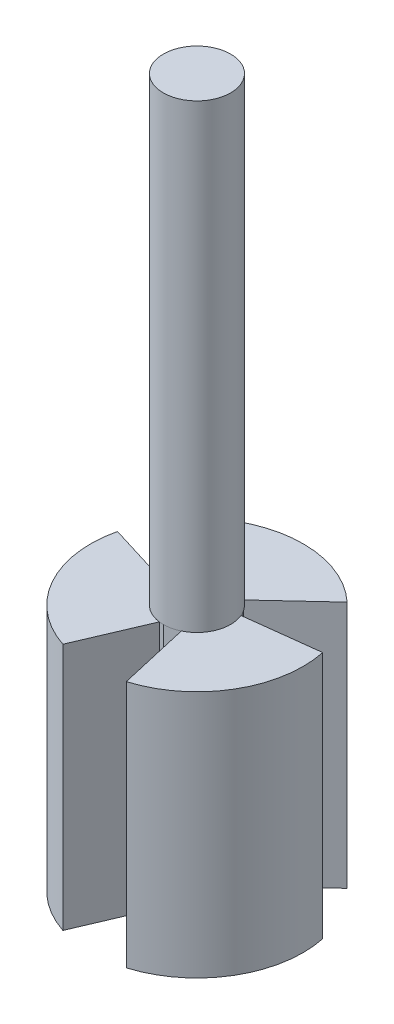
ISO-10303-21;
HEADER;
FILE_DESCRIPTION(('STEP AP214'),'2;1');
FILE_NAME('part.step','',(''),(''),'','','');
FILE_SCHEMA(('AUTOMOTIVE_DESIGN { 1 0 10303 214 1 1 1 1 }'));
ENDSEC;
DATA;
#1=APPLICATION_CONTEXT('core data for automotive mechanical design processes');
#2=APPLICATION_PROTOCOL_DEFINITION('international standard','automotive_design',2000,#1);
#3=PRODUCT_CONTEXT('',#1,'mechanical');
#4=PRODUCT('Part','Part','',(#3));
#5=PRODUCT_RELATED_PRODUCT_CATEGORY('part','',(#4));
#6=PRODUCT_DEFINITION_FORMATION('','',#4);
#7=PRODUCT_DEFINITION_CONTEXT('part definition',#1,'design');
#8=PRODUCT_DEFINITION('design','',#6,#7);
#9=PRODUCT_DEFINITION_SHAPE('','',#8);
#10=(LENGTH_UNIT() NAMED_UNIT(*) SI_UNIT(.MILLI.,.METRE.));
#11=(NAMED_UNIT(*) PLANE_ANGLE_UNIT() SI_UNIT($,.RADIAN.));
#12=(NAMED_UNIT(*) SI_UNIT($,.STERADIAN.) SOLID_ANGLE_UNIT());
#13=UNCERTAINTY_MEASURE_WITH_UNIT(LENGTH_MEASURE(1.E-05),#10,'distance_accuracy_value','');
#14=(GEOMETRIC_REPRESENTATION_CONTEXT(3) GLOBAL_UNCERTAINTY_ASSIGNED_CONTEXT((#13)) GLOBAL_UNIT_ASSIGNED_CONTEXT((#10,
#11,#12)) REPRESENTATION_CONTEXT('',''));
#15=CARTESIAN_POINT('',(0.,0.,0.));
#16=DIRECTION('',(0.,0.,1.));
#17=DIRECTION('',(1.,0.,0.));
#18=AXIS2_PLACEMENT_3D('',#15,#16,#17);
#19=CARTESIAN_POINT('',(0.,70.,0.));
#20=DIRECTION('',(0.,-1.,0.));
#21=DIRECTION('',(0.,0.,-1.));
#22=AXIS2_PLACEMENT_3D('',#19,#20,#21);
#23=CYLINDRICAL_SURFACE('',#22,30.);
#24=DIRECTION('',(0.,-1.,0.));
#25=VECTOR('',#24,1.);
#26=CARTESIAN_POINT('',(-29.225211014232,70.,-6.7739974294068));
#27=LINE('',#26,#25);
#28=CARTESIAN_POINT('',(-29.2252110142321,0.,-6.7739974294068));
#29=VERTEX_POINT('',#28);
#30=CARTESIAN_POINT('',(-29.2252110142321,70.,-6.7739974294068));
#31=VERTEX_POINT('',#30);
#32=EDGE_CURVE('E212',#29,#31,#27,.F.);
#33=ORIENTED_EDGE('',*,*,#32,.F.);
#34=CARTESIAN_POINT('',(0.,0.,0.));
#35=DIRECTION('',(0.,-1.,0.));
#36=DIRECTION('',(0.,0.,-1.));
#37=AXIS2_PLACEMENT_3D('',#34,#35,#36);
#38=CIRCLE('',#37,30.);
#39=CARTESIAN_POINT('',(-9.35973533694648,0.,28.5025499635088));
#40=VERTEX_POINT('',#39);
#41=EDGE_CURVE('E255',#40,#29,#38,.T.);
#42=ORIENTED_EDGE('',*,*,#41,.F.);
#43=DIRECTION('',(0.,-1.,0.));
#44=VECTOR('',#43,1.);
#45=CARTESIAN_POINT('',(-9.35973533694648,70.,28.5025499635088));
#46=LINE('',#45,#44);
#47=CARTESIAN_POINT('',(-9.35973533694648,70.,28.5025499635088));
#48=VERTEX_POINT('',#47);
#49=EDGE_CURVE('E238',#48,#40,#46,.T.);
#50=ORIENTED_EDGE('',*,*,#49,.F.);
#51=CARTESIAN_POINT('',(0.,70.,0.));
#52=DIRECTION('',(0.,-1.,0.));
#53=DIRECTION('',(0.,0.,-1.));
#54=AXIS2_PLACEMENT_3D('',#51,#52,#53);
#55=CIRCLE('',#54,30.);
#56=EDGE_CURVE('E249',#48,#31,#55,.T.);
#57=ORIENTED_EDGE('',*,*,#56,.T.);
#58=EDGE_LOOP('',(#33,#42,#50,#57));
#59=FACE_BOUND('',#58,.T.);
#60=ADVANCED_FACE('F37',(#59),#23,.T.);
#61=DIRECTION('',(0.,-1.,0.));
#62=VECTOR('',#61,1.);
#63=CARTESIAN_POINT('',(-20.0040646725605,70.,-22.357043556249));
#64=LINE('',#63,#62);
#65=CARTESIAN_POINT('',(-20.0040646725605,70.,-22.357043556249));
#66=VERTEX_POINT('',#65);
#67=CARTESIAN_POINT('',(-20.0040646725605,0.,-22.357043556249));
#68=VERTEX_POINT('',#67);
#69=EDGE_CURVE('E210',#66,#68,#64,.T.);
#70=ORIENTED_EDGE('',*,*,#69,.F.);
#71=CARTESIAN_POINT('',(20.4790593661529,70.,-21.9227764545822));
#72=VERTEX_POINT('',#71);
#73=EDGE_CURVE('E253',#66,#72,#55,.T.);
#74=ORIENTED_EDGE('',*,*,#73,.T.);
#75=DIRECTION('',(0.,-1.,0.));
#76=VECTOR('',#75,1.);
#77=CARTESIAN_POINT('',(20.4790593661529,70.,-21.9227764545822));
#78=LINE('',#77,#76);
#79=CARTESIAN_POINT('',(20.4790593661529,0.,-21.9227764545822));
#80=VERTEX_POINT('',#79);
#81=EDGE_CURVE('E208',#80,#72,#78,.F.);
#82=ORIENTED_EDGE('',*,*,#81,.F.);
#83=EDGE_CURVE('E257',#68,#80,#38,.T.);
#84=ORIENTED_EDGE('',*,*,#83,.F.);
#85=EDGE_LOOP('',(#70,#74,#82,#84));
#86=FACE_BOUND('',#85,.T.);
#87=ADVANCED_FACE('F277',(#86),#23,.T.);
#88=CARTESIAN_POINT('',(0.,70.,0.));
#89=DIRECTION('',(0.,-1.,0.));
#90=DIRECTION('',(0.,0.,-1.));
#91=AXIS2_PLACEMENT_3D('',#88,#89,#90);
#92=PLANE('',#91);
#93=CARTESIAN_POINT('',(0.,70.,0.));
#94=DIRECTION('',(0.,-1.,0.));
#95=DIRECTION('',(0.,0.,-1.));
#96=AXIS2_PLACEMENT_3D('',#93,#94,#95);
#97=CIRCLE('',#96,9.5);
#98=CARTESIAN_POINT('',(-1.21301734780421,70.,9.4222390605379));
#99=VERTEX_POINT('',#98);
#100=CARTESIAN_POINT('',(-9.47441557328108,70.,-0.696742093438399));
#101=VERTEX_POINT('',#100);
#102=EDGE_CURVE('E311',#99,#101,#97,.T.);
#103=ORIENTED_EDGE('',*,*,#102,.T.);
#104=DIRECTION('',(0.955777818427239,0.,0.294089717267484));
#105=VECTOR('',#104,1.);
#106=CARTESIAN_POINT('',(-9.47441557328108,70.,-0.696742093438399));
#107=LINE('',#106,#105);
#108=EDGE_CURVE('E168',#31,#101,#107,.T.);
#109=ORIENTED_EDGE('',*,*,#108,.F.);
#110=ORIENTED_EDGE('',*,*,#56,.F.);
#111=DIRECTION('',(-0.392674581394014,0.,0.919677483211933));
#112=VECTOR('',#111,1.);
#113=CARTESIAN_POINT('',(-10.9395756302939,70.,32.2026711674444));
#114=LINE('',#113,#112);
#115=EDGE_CURVE('E231',#99,#48,#114,.T.);
#116=ORIENTED_EDGE('',*,*,#115,.F.);
#117=EDGE_LOOP('',(#103,#109,#110,#116));
#118=FACE_BOUND('',#117,.T.);
#119=ADVANCED_FACE('F331',(#118),#92,.F.);
#120=ORIENTED_EDGE('',*,*,#73,.F.);
#121=DIRECTION('',(-0.60012677305306,0.,-0.799904904513606));
#122=VECTOR('',#121,1.);
#123=CARTESIAN_POINT('',(-22.4185434855765,70.,-25.575285986178));
#124=LINE('',#123,#122);
#125=CARTESIAN_POINT('',(-7.55338971305371,70.,-5.76162336869865));
#126=VERTEX_POINT('',#125);
#127=EDGE_CURVE('E170',#126,#66,#124,.T.);
#128=ORIENTED_EDGE('',*,*,#127,.F.);
#129=CARTESIAN_POINT('',(5.34060413944418,70.,-7.8567135257531));
#130=VERTEX_POINT('',#129);
#131=EDGE_CURVE('E302',#126,#130,#97,.T.);
#132=ORIENTED_EDGE('',*,*,#131,.T.);
#133=DIRECTION('',(-0.732578075359047,0.,0.680683012497914));
#134=VECTOR('',#133,1.);
#135=CARTESIAN_POINT('',(5.34060413944418,70.,-7.8567135257531));
#136=LINE('',#135,#134);
#137=EDGE_CURVE('E187',#72,#130,#136,.T.);
#138=ORIENTED_EDGE('',*,*,#137,.F.);
#139=EDGE_LOOP('',(#120,#128,#132,#138));
#140=FACE_BOUND('',#139,.T.);
#141=ADVANCED_FACE('F334',(#140),#92,.F.);
#142=CARTESIAN_POINT('',(0.,200.,0.));
#143=DIRECTION('',(0.,-1.,0.));
#144=DIRECTION('',(0.,0.,-1.));
#145=AXIS2_PLACEMENT_3D('',#142,#143,#144);
#146=CYLINDRICAL_SURFACE('',#145,9.5);
#147=CARTESIAN_POINT('',(0.,200.,0.));
#148=DIRECTION('',(0.,1.,0.));
#149=DIRECTION('',(0.,0.,1.));
#150=AXIS2_PLACEMENT_3D('',#147,#148,#149);
#151=CIRCLE('',#150,9.5);
#152=CARTESIAN_POINT('',(0.,200.,9.5));
#153=VERTEX_POINT('',#152);
#154=EDGE_CURVE('E252',#153,#153,#151,.T.);
#155=ORIENTED_EDGE('',*,*,#154,.F.);
#156=EDGE_LOOP('',(#155));
#157=FACE_BOUND('',#156,.T.);
#158=CARTESIAN_POINT('',(4.13381143383698,70.,8.5534556191915));
#159=VERTEX_POINT('',#158);
#160=CARTESIAN_POINT('',(0.,70.,9.5));
#161=VERTEX_POINT('',#160);
#162=EDGE_CURVE('E261',#159,#161,#97,.T.);
#163=ORIENTED_EDGE('',*,*,#162,.F.);
#164=CARTESIAN_POINT('',(8.76640706085798,70.,-3.6606156918392));
#165=VERTEX_POINT('',#164);
#166=EDGE_CURVE('E260',#165,#159,#97,.T.);
#167=ORIENTED_EDGE('',*,*,#166,.F.);
#168=CARTESIAN_POINT('',(8.22724133595221,70.,-4.74999999999992));
#169=VERTEX_POINT('',#168);
#170=EDGE_CURVE('E298',#169,#165,#97,.T.);
#171=ORIENTED_EDGE('',*,*,#170,.F.);
#172=EDGE_CURVE('E299',#130,#169,#97,.T.);
#173=ORIENTED_EDGE('',*,*,#172,.F.);
#174=ORIENTED_EDGE('',*,*,#131,.F.);
#175=CARTESIAN_POINT('',(-8.22724133595215,70.,-4.75000000000004));
#176=VERTEX_POINT('',#175);
#177=EDGE_CURVE('E307',#176,#126,#97,.T.);
#178=ORIENTED_EDGE('',*,*,#177,.F.);
#179=EDGE_CURVE('E309',#101,#176,#97,.T.);
#180=ORIENTED_EDGE('',*,*,#179,.F.);
#181=ORIENTED_EDGE('',*,*,#102,.F.);
#182=EDGE_CURVE('E264',#161,#99,#97,.T.);
#183=ORIENTED_EDGE('',*,*,#182,.F.);
#184=EDGE_LOOP('',(#163,#167,#171,#173,#174,#178,#180,#181,#183));
#185=FACE_BOUND('',#184,.T.);
#186=ADVANCED_FACE('F39',(#157,#185),#146,.T.);
#187=CARTESIAN_POINT('',(0.,200.,0.));
#188=DIRECTION('',(0.,1.,0.));
#189=DIRECTION('',(0.,0.,1.));
#190=AXIS2_PLACEMENT_3D('',#187,#188,#189);
#191=PLANE('',#190);
#192=ORIENTED_EDGE('',*,*,#154,.T.);
#193=EDGE_LOOP('',(#192));
#194=FACE_BOUND('',#193,.T.);
#195=ADVANCED_FACE('F333',(#194),#191,.T.);
#196=DIRECTION('',(0.,-1.,0.));
#197=VECTOR('',#196,1.);
#198=CARTESIAN_POINT('',(29.3638000095071,70.,-6.14550640725957));
#199=LINE('',#198,#197);
#200=CARTESIAN_POINT('',(29.3638000095071,70.,-6.14550640725957));
#201=VERTEX_POINT('',#200);
#202=CARTESIAN_POINT('',(29.3638000095071,0.,-6.14550640725957));
#203=VERTEX_POINT('',#202);
#204=EDGE_CURVE('E181',#201,#203,#199,.T.);
#205=ORIENTED_EDGE('',*,*,#204,.F.);
#206=CARTESIAN_POINT('',(8.74615164807938,70.,28.6967738839891));
#207=VERTEX_POINT('',#206);
#208=EDGE_CURVE('E254',#201,#207,#55,.T.);
#209=ORIENTED_EDGE('',*,*,#208,.T.);
#210=DIRECTION('',(0.,-1.,0.));
#211=VECTOR('',#210,1.);
#212=CARTESIAN_POINT('',(8.74615164807938,70.,28.6967738839891));
#213=LINE('',#212,#211);
#214=CARTESIAN_POINT('',(8.74615164807938,0.,28.6967738839891));
#215=VERTEX_POINT('',#214);
#216=EDGE_CURVE('E245',#215,#207,#213,.F.);
#217=ORIENTED_EDGE('',*,*,#216,.F.);
#218=EDGE_CURVE('E248',#203,#215,#38,.T.);
#219=ORIENTED_EDGE('',*,*,#218,.F.);
#220=EDGE_LOOP('',(#205,#209,#217,#219));
#221=FACE_BOUND('',#220,.T.);
#222=ADVANCED_FACE('F285',(#221),#23,.T.);
#223=ORIENTED_EDGE('',*,*,#208,.F.);
#224=DIRECTION('',(0.992801354447079,0.,-0.119772578698321));
#225=VECTOR('',#224,1.);
#226=CARTESIAN_POINT('',(33.3581191158705,70.,-6.62738518126624));
#227=LINE('',#226,#225);
#228=EDGE_CURVE('E198',#165,#201,#227,.T.);
#229=ORIENTED_EDGE('',*,*,#228,.F.);
#230=ORIENTED_EDGE('',*,*,#166,.T.);
#231=DIRECTION('',(-0.2231997430682,0.,-0.9747727297654));
#232=VECTOR('',#231,1.);
#233=CARTESIAN_POINT('',(4.13381143383698,70.,8.5534556191915));
#234=LINE('',#233,#232);
#235=EDGE_CURVE('E219',#207,#159,#234,.T.);
#236=ORIENTED_EDGE('',*,*,#235,.F.);
#237=EDGE_LOOP('',(#223,#229,#230,#236));
#238=FACE_BOUND('',#237,.T.);
#239=ADVANCED_FACE('F293',(#238),#92,.F.);
#240=CARTESIAN_POINT('',(0.,0.,0.));
#241=DIRECTION('',(0.,1.,0.));
#242=DIRECTION('',(0.,0.,1.));
#243=AXIS2_PLACEMENT_3D('',#240,#241,#242);
#244=PLANE('',#243);
#245=ORIENTED_EDGE('',*,*,#41,.T.);
#246=DIRECTION('',(0.955777818427239,0.,0.294089717267484));
#247=VECTOR('',#246,1.);
#248=CARTESIAN_POINT('',(-0.623587118664468,0.,2.02662895328082));
#249=LINE('',#248,#247);
#250=CARTESIAN_POINT('',(-9.47441557328108,0.,-0.696742093438399));
#251=VERTEX_POINT('',#250);
#252=EDGE_CURVE('E11',#29,#251,#249,.T.);
#253=ORIENTED_EDGE('',*,*,#252,.T.);
#254=DIRECTION('',(0.294089717267484,0.,-0.955777818427239));
#255=VECTOR('',#254,1.);
#256=CARTESIAN_POINT('',(-8.22724133595215,0.,-4.75000000000004));
#257=LINE('',#256,#255);
#258=CARTESIAN_POINT('',(-8.22724133595215,0.,-4.75000000000004));
#259=VERTEX_POINT('',#258);
#260=EDGE_CURVE('E152',#251,#259,#257,.T.);
#261=ORIENTED_EDGE('',*,*,#260,.T.);
#262=DIRECTION('',(0.554378946406689,0.,-0.832264371327411));
#263=VECTOR('',#262,1.);
#264=CARTESIAN_POINT('',(-7.55338971305371,0.,-5.76162336869865));
#265=LINE('',#264,#263);
#266=CARTESIAN_POINT('',(-7.55338971305371,0.,-5.76162336869865));
#267=VERTEX_POINT('',#266);
#268=EDGE_CURVE('E162',#259,#267,#265,.T.);
#269=ORIENTED_EDGE('',*,*,#268,.T.);
#270=DIRECTION('',(-0.60012677305306,0.,-0.799904904513606));
#271=VECTOR('',#270,1.);
#272=CARTESIAN_POINT('',(-22.4185434855765,0.,-25.575285986178));
#273=LINE('',#272,#271);
#274=EDGE_CURVE('E52',#267,#68,#273,.T.);
#275=ORIENTED_EDGE('',*,*,#274,.T.);
#276=ORIENTED_EDGE('',*,*,#83,.T.);
#277=DIRECTION('',(-0.732578075359047,0.,0.680683012497914));
#278=VECTOR('',#277,1.);
#279=CARTESIAN_POINT('',(-1.44331859825402,0.,-1.55335676287659));
#280=LINE('',#279,#278);
#281=CARTESIAN_POINT('',(5.34060413944418,0.,-7.8567135257531));
#282=VERTEX_POINT('',#281);
#283=EDGE_CURVE('E45',#80,#282,#280,.T.);
#284=ORIENTED_EDGE('',*,*,#283,.T.);
#285=DIRECTION('',(0.680683012497914,0.,0.732578075359046));
#286=VECTOR('',#285,1.);
#287=CARTESIAN_POINT('',(8.22724133595221,0.,-4.74999999999992));
#288=LINE('',#287,#286);
#289=CARTESIAN_POINT('',(8.22724133595221,0.,-4.74999999999992));
#290=VERTEX_POINT('',#289);
#291=EDGE_CURVE('E183',#282,#290,#288,.T.);
#292=ORIENTED_EDGE('',*,*,#291,.T.);
#293=DIRECTION('',(0.443572615030874,0.,0.896238436575151));
#294=VECTOR('',#293,1.);
#295=CARTESIAN_POINT('',(8.76640706085798,0.,-3.6606156918392));
#296=LINE('',#295,#294);
#297=CARTESIAN_POINT('',(8.76640706085798,0.,-3.6606156918392));
#298=VERTEX_POINT('',#297);
#299=EDGE_CURVE('E186',#290,#298,#296,.T.);
#300=ORIENTED_EDGE('',*,*,#299,.T.);
#301=DIRECTION('',(0.992801354447079,0.,-0.119772578698321));
#302=VECTOR('',#301,1.);
#303=CARTESIAN_POINT('',(33.3581191158705,0.,-6.62738518126624));
#304=LINE('',#303,#302);
#305=EDGE_CURVE('E60',#298,#203,#304,.T.);
#306=ORIENTED_EDGE('',*,*,#305,.T.);
#307=ORIENTED_EDGE('',*,*,#218,.T.);
#308=DIRECTION('',(-0.2231997430682,0.,-0.9747727297654));
#309=VECTOR('',#308,1.);
#310=CARTESIAN_POINT('',(2.06690571691849,0.,-0.473272190404249));
#311=LINE('',#310,#309);
#312=CARTESIAN_POINT('',(4.13381143383698,0.,8.5534556191915));
#313=VERTEX_POINT('',#312);
#314=EDGE_CURVE('E263',#215,#313,#311,.T.);
#315=ORIENTED_EDGE('',*,*,#314,.T.);
#316=DIRECTION('',(-0.9747727297654,0.,0.2231997430682));
#317=VECTOR('',#316,1.);
#318=CARTESIAN_POINT('',(0.,0.,9.5));
#319=LINE('',#318,#317);
#320=CARTESIAN_POINT('',(0.,0.,9.5));
#321=VERTEX_POINT('',#320);
#322=EDGE_CURVE('E215',#313,#321,#319,.T.);
#323=ORIENTED_EDGE('',*,*,#322,.T.);
#324=DIRECTION('',(-0.997951561437567,0.,-0.0639740652477342));
#325=VECTOR('',#324,1.);
#326=CARTESIAN_POINT('',(-1.21301734780421,0.,9.4222390605379));
#327=LINE('',#326,#325);
#328=CARTESIAN_POINT('',(-1.21301734780421,0.,9.4222390605379));
#329=VERTEX_POINT('',#328);
#330=EDGE_CURVE('E218',#321,#329,#327,.T.);
#331=ORIENTED_EDGE('',*,*,#330,.T.);
#332=DIRECTION('',(-0.392674581394014,0.,0.919677483211933));
#333=VECTOR('',#332,1.);
#334=CARTESIAN_POINT('',(-10.9395756302939,0.,32.2026711674444));
#335=LINE('',#334,#333);
#336=EDGE_CURVE('E222',#329,#40,#335,.T.);
#337=ORIENTED_EDGE('',*,*,#336,.T.);
#338=EDGE_LOOP('',(#245,#253,#261,#269,#275,#276,#284,#292,#300,#306,#307,#315,#323,#331,#337));
#339=FACE_BOUND('',#338,.T.);
#340=ADVANCED_FACE('F167',(#339),#244,.F.);
#341=CARTESIAN_POINT('',(0.,70.,0.));
#342=DIRECTION('',(0.,-1.,0.));
#343=DIRECTION('',(0.,0.,-1.));
#344=AXIS2_PLACEMENT_3D('',#341,#342,#343);
#345=PLANE('',#344);
#346=ORIENTED_EDGE('',*,*,#162,.T.);
#347=DIRECTION('',(-0.9747727297654,0.,0.2231997430682));
#348=VECTOR('',#347,1.);
#349=CARTESIAN_POINT('',(0.,70.,9.5));
#350=LINE('',#349,#348);
#351=EDGE_CURVE('E214',#159,#161,#350,.T.);
#352=ORIENTED_EDGE('',*,*,#351,.F.);
#353=EDGE_LOOP('',(#346,#352));
#354=FACE_BOUND('',#353,.T.);
#355=ADVANCED_FACE('F358',(#354),#345,.T.);
#356=ORIENTED_EDGE('',*,*,#182,.T.);
#357=DIRECTION('',(-0.997951561437567,0.,-0.0639740652477342));
#358=VECTOR('',#357,1.);
#359=CARTESIAN_POINT('',(-1.21301734780421,70.,9.4222390605379));
#360=LINE('',#359,#358);
#361=EDGE_CURVE('E228',#161,#99,#360,.T.);
#362=ORIENTED_EDGE('',*,*,#361,.F.);
#363=EDGE_LOOP('',(#356,#362));
#364=FACE_BOUND('',#363,.T.);
#365=ADVANCED_FACE('F322',(#364),#345,.T.);
#366=CARTESIAN_POINT('',(0.,0.,9.5));
#367=DIRECTION('',(-0.2231997430682,0.,-0.9747727297654));
#368=DIRECTION('',(-0.9747727297654,0.,0.2231997430682));
#369=AXIS2_PLACEMENT_3D('',#366,#367,#368);
#370=PLANE('',#369);
#371=ORIENTED_EDGE('',*,*,#351,.T.);
#372=DIRECTION('',(0.,1.,0.));
#373=VECTOR('',#372,1.);
#374=CARTESIAN_POINT('',(0.,0.,9.5));
#375=LINE('',#374,#373);
#376=EDGE_CURVE('E225',#321,#161,#375,.T.);
#377=ORIENTED_EDGE('',*,*,#376,.F.);
#378=ORIENTED_EDGE('',*,*,#322,.F.);
#379=DIRECTION('',(0.,1.,0.));
#380=VECTOR('',#379,1.);
#381=CARTESIAN_POINT('',(4.13381143383698,0.,8.5534556191915));
#382=LINE('',#381,#380);
#383=EDGE_CURVE('E235',#313,#159,#382,.T.);
#384=ORIENTED_EDGE('',*,*,#383,.T.);
#385=EDGE_LOOP('',(#371,#377,#378,#384));
#386=FACE_BOUND('',#385,.T.);
#387=ADVANCED_FACE('F534',(#386),#370,.F.);
#388=CARTESIAN_POINT('',(4.13381143383698,0.,8.5534556191915));
#389=DIRECTION('',(0.9747727297654,0.,-0.2231997430682));
#390=DIRECTION('',(-0.2231997430682,0.,-0.9747727297654));
#391=AXIS2_PLACEMENT_3D('',#388,#389,#390);
#392=PLANE('',#391);
#393=ORIENTED_EDGE('',*,*,#216,.T.);
#394=ORIENTED_EDGE('',*,*,#235,.T.);
#395=ORIENTED_EDGE('',*,*,#383,.F.);
#396=ORIENTED_EDGE('',*,*,#314,.F.);
#397=EDGE_LOOP('',(#393,#394,#395,#396));
#398=FACE_BOUND('',#397,.T.);
#399=ADVANCED_FACE('F292',(#398),#392,.F.);
#400=CARTESIAN_POINT('',(-10.9395756302939,0.,32.2026711674444));
#401=DIRECTION('',(-0.919677483211933,0.,-0.392674581394014));
#402=DIRECTION('',(-0.392674581394014,0.,0.919677483211933));
#403=AXIS2_PLACEMENT_3D('',#400,#401,#402);
#404=PLANE('',#403);
#405=ORIENTED_EDGE('',*,*,#49,.T.);
#406=ORIENTED_EDGE('',*,*,#336,.F.);
#407=DIRECTION('',(0.,1.,0.));
#408=VECTOR('',#407,1.);
#409=CARTESIAN_POINT('',(-1.21301734780421,0.,9.4222390605379));
#410=LINE('',#409,#408);
#411=EDGE_CURVE('E239',#329,#99,#410,.T.);
#412=ORIENTED_EDGE('',*,*,#411,.T.);
#413=ORIENTED_EDGE('',*,*,#115,.T.);
#414=EDGE_LOOP('',(#405,#406,#412,#413));
#415=FACE_BOUND('',#414,.T.);
#416=ADVANCED_FACE('F325',(#415),#404,.F.);
#417=CARTESIAN_POINT('',(-1.21301734780421,0.,9.4222390605379));
#418=DIRECTION('',(0.0639740652477342,0.,-0.997951561437567));
#419=DIRECTION('',(-0.997951561437567,0.,-0.0639740652477342));
#420=AXIS2_PLACEMENT_3D('',#417,#418,#419);
#421=PLANE('',#420);
#422=ORIENTED_EDGE('',*,*,#361,.T.);
#423=ORIENTED_EDGE('',*,*,#411,.F.);
#424=ORIENTED_EDGE('',*,*,#330,.F.);
#425=ORIENTED_EDGE('',*,*,#376,.T.);
#426=EDGE_LOOP('',(#422,#423,#424,#425));
#427=FACE_BOUND('',#426,.T.);
#428=ADVANCED_FACE('F329',(#427),#421,.F.);
#429=CARTESIAN_POINT('',(0.,70.,0.));
#430=DIRECTION('',(0.,-1.,0.));
#431=DIRECTION('',(-0.866025403784443,0.,0.499999999999992));
#432=AXIS2_PLACEMENT_3D('',#429,#430,#431);
#433=PLANE('',#432);
#434=ORIENTED_EDGE('',*,*,#172,.T.);
#435=DIRECTION('',(0.680683012497914,0.,0.732578075359046));
#436=VECTOR('',#435,1.);
#437=CARTESIAN_POINT('',(8.22724133595221,70.,-4.74999999999992));
#438=LINE('',#437,#436);
#439=EDGE_CURVE('E192',#130,#169,#438,.T.);
#440=ORIENTED_EDGE('',*,*,#439,.F.);
#441=EDGE_LOOP('',(#434,#440));
#442=FACE_BOUND('',#441,.T.);
#443=ADVANCED_FACE('F412',(#442),#433,.T.);
#444=ORIENTED_EDGE('',*,*,#170,.T.);
#445=DIRECTION('',(0.443572615030874,0.,0.896238436575151));
#446=VECTOR('',#445,1.);
#447=CARTESIAN_POINT('',(8.76640706085798,70.,-3.6606156918392));
#448=LINE('',#447,#446);
#449=EDGE_CURVE('E195',#169,#165,#448,.T.);
#450=ORIENTED_EDGE('',*,*,#449,.F.);
#451=EDGE_LOOP('',(#444,#450));
#452=FACE_BOUND('',#451,.T.);
#453=ADVANCED_FACE('F417',(#452),#433,.T.);
#454=CARTESIAN_POINT('',(8.22724133595221,0.,-4.74999999999992));
#455=DIRECTION('',(-0.732578075359047,0.,0.680683012497914));
#456=DIRECTION('',(0.680683012497914,0.,0.732578075359047));
#457=AXIS2_PLACEMENT_3D('',#454,#455,#456);
#458=PLANE('',#457);
#459=ORIENTED_EDGE('',*,*,#439,.T.);
#460=DIRECTION('',(0.,1.,0.));
#461=VECTOR('',#460,1.);
#462=CARTESIAN_POINT('',(8.22724133595221,0.,-4.74999999999992));
#463=LINE('',#462,#461);
#464=EDGE_CURVE('E191',#290,#169,#463,.T.);
#465=ORIENTED_EDGE('',*,*,#464,.F.);
#466=ORIENTED_EDGE('',*,*,#291,.F.);
#467=DIRECTION('',(0.,1.,0.));
#468=VECTOR('',#467,1.);
#469=CARTESIAN_POINT('',(5.34060413944418,0.,-7.8567135257531));
#470=LINE('',#469,#468);
#471=EDGE_CURVE('E176',#282,#130,#470,.T.);
#472=ORIENTED_EDGE('',*,*,#471,.T.);
#473=EDGE_LOOP('',(#459,#465,#466,#472));
#474=FACE_BOUND('',#473,.T.);
#475=ADVANCED_FACE('F428',(#474),#458,.F.);
#476=CARTESIAN_POINT('',(5.34060413944418,0.,-7.8567135257531));
#477=DIRECTION('',(-0.680683012497914,0.,-0.732578075359047));
#478=DIRECTION('',(-0.732578075359047,0.,0.680683012497914));
#479=AXIS2_PLACEMENT_3D('',#476,#477,#478);
#480=PLANE('',#479);
#481=ORIENTED_EDGE('',*,*,#81,.T.);
#482=ORIENTED_EDGE('',*,*,#137,.T.);
#483=ORIENTED_EDGE('',*,*,#471,.F.);
#484=ORIENTED_EDGE('',*,*,#283,.F.);
#485=EDGE_LOOP('',(#481,#482,#483,#484));
#486=FACE_BOUND('',#485,.T.);
#487=ADVANCED_FACE('F272',(#486),#480,.F.);
#488=CARTESIAN_POINT('',(33.3581191158705,0.,-6.62738518126624));
#489=DIRECTION('',(0.119772578698321,0.,0.992801354447079));
#490=DIRECTION('',(0.992801354447079,0.,-0.119772578698321));
#491=AXIS2_PLACEMENT_3D('',#488,#489,#490);
#492=PLANE('',#491);
#493=ORIENTED_EDGE('',*,*,#204,.T.);
#494=ORIENTED_EDGE('',*,*,#305,.F.);
#495=DIRECTION('',(0.,1.,0.));
#496=VECTOR('',#495,1.);
#497=CARTESIAN_POINT('',(8.76640706085798,0.,-3.6606156918392));
#498=LINE('',#497,#496);
#499=EDGE_CURVE('E203',#298,#165,#498,.T.);
#500=ORIENTED_EDGE('',*,*,#499,.T.);
#501=ORIENTED_EDGE('',*,*,#228,.T.);
#502=EDGE_LOOP('',(#493,#494,#500,#501));
#503=FACE_BOUND('',#502,.T.);
#504=ADVANCED_FACE('F446',(#503),#492,.F.);
#505=CARTESIAN_POINT('',(8.76640706085798,0.,-3.6606156918392));
#506=DIRECTION('',(-0.896238436575152,0.,0.443572615030874));
#507=DIRECTION('',(0.443572615030874,0.,0.896238436575152));
#508=AXIS2_PLACEMENT_3D('',#505,#506,#507);
#509=PLANE('',#508);
#510=ORIENTED_EDGE('',*,*,#449,.T.);
#511=ORIENTED_EDGE('',*,*,#499,.F.);
#512=ORIENTED_EDGE('',*,*,#299,.F.);
#513=ORIENTED_EDGE('',*,*,#464,.T.);
#514=EDGE_LOOP('',(#510,#511,#512,#513));
#515=FACE_BOUND('',#514,.T.);
#516=ADVANCED_FACE('F455',(#515),#509,.F.);
#517=CARTESIAN_POINT('',(0.,70.,0.));
#518=DIRECTION('',(0.,-1.,0.));
#519=DIRECTION('',(0.866025403784436,0.,0.500000000000004));
#520=AXIS2_PLACEMENT_3D('',#517,#518,#519);
#521=PLANE('',#520);
#522=ORIENTED_EDGE('',*,*,#179,.T.);
#523=DIRECTION('',(0.294089717267484,0.,-0.955777818427239));
#524=VECTOR('',#523,1.);
#525=CARTESIAN_POINT('',(-8.22724133595215,70.,-4.75000000000004));
#526=LINE('',#525,#524);
#527=EDGE_CURVE('E154',#101,#176,#526,.T.);
#528=ORIENTED_EDGE('',*,*,#527,.F.);
#529=EDGE_LOOP('',(#522,#528));
#530=FACE_BOUND('',#529,.T.);
#531=ADVANCED_FACE('F464',(#530),#521,.T.);
#532=ORIENTED_EDGE('',*,*,#177,.T.);
#533=DIRECTION('',(0.554378946406689,0.,-0.832264371327411));
#534=VECTOR('',#533,1.);
#535=CARTESIAN_POINT('',(-7.55338971305371,70.,-5.76162336869865));
#536=LINE('',#535,#534);
#537=EDGE_CURVE('E175',#176,#126,#536,.T.);
#538=ORIENTED_EDGE('',*,*,#537,.F.);
#539=EDGE_LOOP('',(#532,#538));
#540=FACE_BOUND('',#539,.T.);
#541=ADVANCED_FACE('F474',(#540),#521,.T.);
#542=CARTESIAN_POINT('',(-8.22724133595215,0.,-4.75000000000004));
#543=DIRECTION('',(0.955777818427239,0.,0.294089717267484));
#544=DIRECTION('',(0.294089717267484,0.,-0.955777818427239));
#545=AXIS2_PLACEMENT_3D('',#542,#543,#544);
#546=PLANE('',#545);
#547=ORIENTED_EDGE('',*,*,#527,.T.);
#548=DIRECTION('',(0.,1.,0.));
#549=VECTOR('',#548,1.);
#550=CARTESIAN_POINT('',(-8.22724133595215,0.,-4.75000000000004));
#551=LINE('',#550,#549);
#552=EDGE_CURVE('E147',#259,#176,#551,.T.);
#553=ORIENTED_EDGE('',*,*,#552,.F.);
#554=ORIENTED_EDGE('',*,*,#260,.F.);
#555=DIRECTION('',(0.,1.,0.));
#556=VECTOR('',#555,1.);
#557=CARTESIAN_POINT('',(-9.47441557328108,0.,-0.696742093438399));
#558=LINE('',#557,#556);
#559=EDGE_CURVE('E179',#251,#101,#558,.T.);
#560=ORIENTED_EDGE('',*,*,#559,.T.);
#561=EDGE_LOOP('',(#547,#553,#554,#560));
#562=FACE_BOUND('',#561,.T.);
#563=ADVANCED_FACE('F149',(#562),#546,.F.);
#564=CARTESIAN_POINT('',(-9.47441557328108,0.,-0.696742093438399));
#565=DIRECTION('',(-0.294089717267484,0.,0.955777818427239));
#566=DIRECTION('',(0.955777818427239,0.,0.294089717267484));
#567=AXIS2_PLACEMENT_3D('',#564,#565,#566);
#568=PLANE('',#567);
#569=ORIENTED_EDGE('',*,*,#32,.T.);
#570=ORIENTED_EDGE('',*,*,#108,.T.);
#571=ORIENTED_EDGE('',*,*,#559,.F.);
#572=ORIENTED_EDGE('',*,*,#252,.F.);
#573=EDGE_LOOP('',(#569,#570,#571,#572));
#574=FACE_BOUND('',#573,.T.);
#575=ADVANCED_FACE('F490',(#574),#568,.F.);
#576=CARTESIAN_POINT('',(-22.4185434855765,0.,-25.575285986178));
#577=DIRECTION('',(0.799904904513606,0.,-0.60012677305306));
#578=DIRECTION('',(-0.60012677305306,0.,-0.799904904513606));
#579=AXIS2_PLACEMENT_3D('',#576,#577,#578);
#580=PLANE('',#579);
#581=ORIENTED_EDGE('',*,*,#69,.T.);
#582=ORIENTED_EDGE('',*,*,#274,.F.);
#583=DIRECTION('',(0.,1.,0.));
#584=VECTOR('',#583,1.);
#585=CARTESIAN_POINT('',(-7.55338971305371,0.,-5.76162336869865));
#586=LINE('',#585,#584);
#587=EDGE_CURVE('E159',#267,#126,#586,.T.);
#588=ORIENTED_EDGE('',*,*,#587,.T.);
#589=ORIENTED_EDGE('',*,*,#127,.T.);
#590=EDGE_LOOP('',(#581,#582,#588,#589));
#591=FACE_BOUND('',#590,.T.);
#592=ADVANCED_FACE('F500',(#591),#580,.F.);
#593=CARTESIAN_POINT('',(-7.55338971305371,0.,-5.76162336869865));
#594=DIRECTION('',(0.83226437132741,0.,0.554378946406688));
#595=DIRECTION('',(0.554378946406689,0.,-0.832264371327411));
#596=AXIS2_PLACEMENT_3D('',#593,#594,#595);
#597=PLANE('',#596);
#598=ORIENTED_EDGE('',*,*,#537,.T.);
#599=ORIENTED_EDGE('',*,*,#587,.F.);
#600=ORIENTED_EDGE('',*,*,#268,.F.);
#601=ORIENTED_EDGE('',*,*,#552,.T.);
#602=EDGE_LOOP('',(#598,#599,#600,#601));
#603=FACE_BOUND('',#602,.T.);
#604=ADVANCED_FACE('F163',(#603),#597,.F.);
#605=CLOSED_SHELL('',(#60,#87,#119,#141,#186,#195,#222,#239,#340,#355,#365,#387,#399,#416,#428,
#443,#453,#475,#487,#504,#516,#531,#541,#563,#575,#592,#604));
#606=MANIFOLD_SOLID_BREP('B2',#605);
#607=ADVANCED_BREP_SHAPE_REPRESENTATION('',(#18,#606),#14);
#608=SHAPE_DEFINITION_REPRESENTATION(#9,#607);
ENDSEC;
END-ISO-10303-21;
